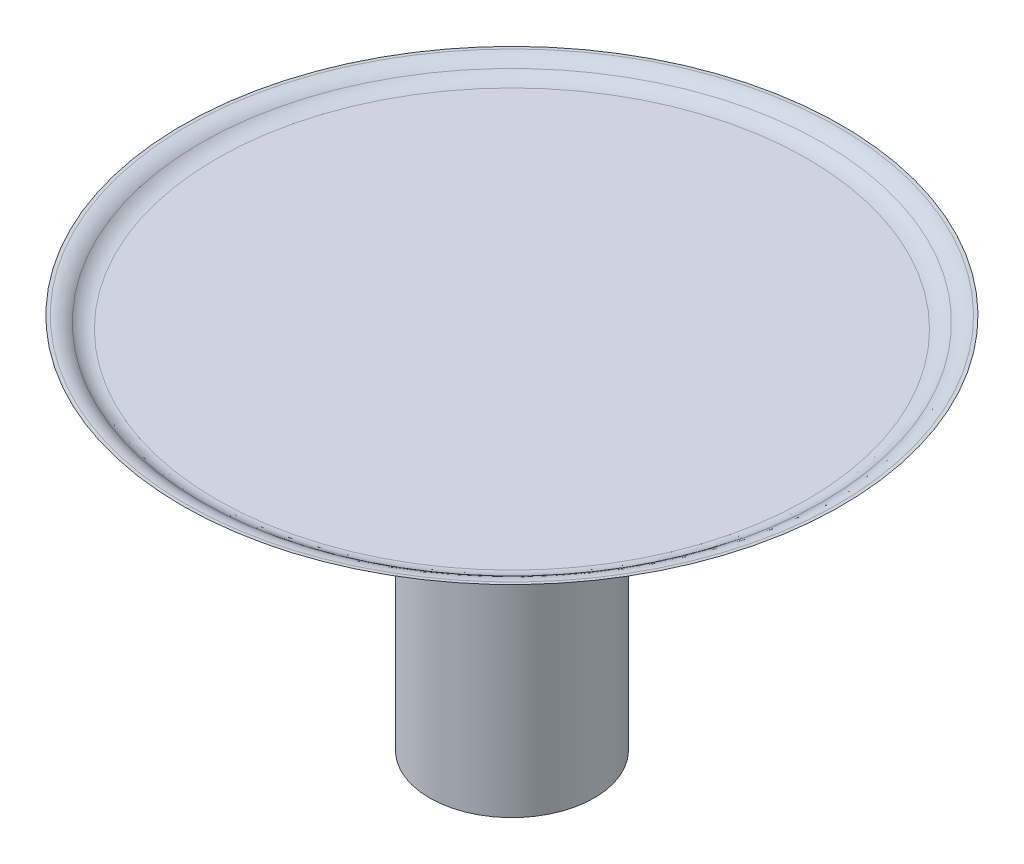
ISO-10303-21;
HEADER;
FILE_DESCRIPTION(('STEP AP214'),'2;1');
FILE_NAME('part.step','',(''),(''),'','','');
FILE_SCHEMA(('AUTOMOTIVE_DESIGN { 1 0 10303 214 1 1 1 1 }'));
ENDSEC;
DATA;
#1=APPLICATION_CONTEXT('core data for automotive mechanical design processes');
#2=APPLICATION_PROTOCOL_DEFINITION('international standard','automotive_design',2000,#1);
#3=PRODUCT_CONTEXT('',#1,'mechanical');
#4=PRODUCT('Part','Part','',(#3));
#5=PRODUCT_RELATED_PRODUCT_CATEGORY('part','',(#4));
#6=PRODUCT_DEFINITION_FORMATION('','',#4);
#7=PRODUCT_DEFINITION_CONTEXT('part definition',#1,'design');
#8=PRODUCT_DEFINITION('design','',#6,#7);
#9=PRODUCT_DEFINITION_SHAPE('','',#8);
#10=(LENGTH_UNIT() NAMED_UNIT(*) SI_UNIT(.MILLI.,.METRE.));
#11=(NAMED_UNIT(*) PLANE_ANGLE_UNIT() SI_UNIT($,.RADIAN.));
#12=(NAMED_UNIT(*) SI_UNIT($,.STERADIAN.) SOLID_ANGLE_UNIT());
#13=UNCERTAINTY_MEASURE_WITH_UNIT(LENGTH_MEASURE(1.E-05),#10,'distance_accuracy_value','');
#14=(GEOMETRIC_REPRESENTATION_CONTEXT(3) GLOBAL_UNCERTAINTY_ASSIGNED_CONTEXT((#13)) GLOBAL_UNIT_ASSIGNED_CONTEXT((#10,
#11,#12)) REPRESENTATION_CONTEXT('',''));
#15=CARTESIAN_POINT('',(0.,0.,0.));
#16=DIRECTION('',(0.,0.,1.));
#17=DIRECTION('',(1.,0.,0.));
#18=AXIS2_PLACEMENT_3D('',#15,#16,#17);
#19=CARTESIAN_POINT('',(0.,10.,0.));
#20=DIRECTION('',(0.,-1.,0.));
#21=DIRECTION('',(0.,0.,-1.));
#22=AXIS2_PLACEMENT_3D('',#19,#20,#21);
#23=CYLINDRICAL_SURFACE('',#22,3.5);
#24=CARTESIAN_POINT('',(0.,10.,0.));
#25=DIRECTION('',(0.,1.,0.));
#26=DIRECTION('',(0.,0.,1.));
#27=AXIS2_PLACEMENT_3D('',#24,#25,#26);
#28=CIRCLE('',#27,3.5);
#29=CARTESIAN_POINT('',(0.,10.,3.5));
#30=VERTEX_POINT('',#29);
#31=EDGE_CURVE('E78',#30,#30,#28,.T.);
#32=ORIENTED_EDGE('',*,*,#31,.F.);
#33=EDGE_LOOP('',(#32));
#34=FACE_BOUND('',#33,.T.);
#35=CARTESIAN_POINT('',(0.,0.,0.));
#36=DIRECTION('',(0.,1.,0.));
#37=DIRECTION('',(0.,0.,1.));
#38=AXIS2_PLACEMENT_3D('',#35,#36,#37);
#39=CIRCLE('',#38,3.5);
#40=CARTESIAN_POINT('',(0.,0.,3.5));
#41=VERTEX_POINT('',#40);
#42=EDGE_CURVE('E74',#41,#41,#39,.T.);
#43=ORIENTED_EDGE('',*,*,#42,.T.);
#44=EDGE_LOOP('',(#43));
#45=FACE_BOUND('',#44,.T.);
#46=ADVANCED_FACE('F49',(#34,#45),#23,.T.);
#47=CARTESIAN_POINT('',(0.,10.,0.));
#48=DIRECTION('',(0.,1.,0.));
#49=DIRECTION('',(0.,0.,1.));
#50=AXIS2_PLACEMENT_3D('',#47,#48,#49);
#51=PLANE('',#50);
#52=CARTESIAN_POINT('',(0.,10.,0.));
#53=DIRECTION('',(0.,1.,0.));
#54=DIRECTION('',(0.,0.,1.));
#55=AXIS2_PLACEMENT_3D('',#52,#53,#54);
#56=CIRCLE('',#55,2.5);
#57=CARTESIAN_POINT('',(0.,10.,2.5));
#58=VERTEX_POINT('',#57);
#59=EDGE_CURVE('E73',#58,#58,#56,.T.);
#60=ORIENTED_EDGE('',*,*,#59,.F.);
#61=EDGE_LOOP('',(#60));
#62=FACE_BOUND('',#61,.T.);
#63=ORIENTED_EDGE('',*,*,#31,.T.);
#64=EDGE_LOOP('',(#63));
#65=FACE_BOUND('',#64,.T.);
#66=ADVANCED_FACE('F121',(#62,#65),#51,.T.);
#67=CARTESIAN_POINT('',(0.,0.,0.));
#68=DIRECTION('',(0.,1.,0.));
#69=DIRECTION('',(0.,0.,1.));
#70=AXIS2_PLACEMENT_3D('',#67,#68,#69);
#71=PLANE('',#70);
#72=ORIENTED_EDGE('',*,*,#42,.F.);
#73=EDGE_LOOP('',(#72));
#74=FACE_BOUND('',#73,.T.);
#75=ADVANCED_FACE('F127',(#74),#71,.F.);
#76=CARTESIAN_POINT('',(0.,12.,0.));
#77=DIRECTION('',(0.,-1.,0.));
#78=DIRECTION('',(0.,0.,-1.));
#79=AXIS2_PLACEMENT_3D('',#76,#77,#78);
#80=CYLINDRICAL_SURFACE('',#79,2.5);
#81=CARTESIAN_POINT('',(0.,12.,0.));
#82=DIRECTION('',(0.,1.,0.));
#83=DIRECTION('',(0.,0.,1.));
#84=AXIS2_PLACEMENT_3D('',#81,#82,#83);
#85=CIRCLE('',#84,2.5);
#86=CARTESIAN_POINT('',(0.,12.,2.5));
#87=VERTEX_POINT('',#86);
#88=EDGE_CURVE('E79',#87,#87,#85,.T.);
#89=ORIENTED_EDGE('',*,*,#88,.F.);
#90=EDGE_LOOP('',(#89));
#91=FACE_BOUND('',#90,.T.);
#92=ORIENTED_EDGE('',*,*,#59,.T.);
#93=EDGE_LOOP('',(#92));
#94=FACE_BOUND('',#93,.T.);
#95=ADVANCED_FACE('F133',(#91,#94),#80,.T.);
#96=CARTESIAN_POINT('',(0.,14.,0.));
#97=DIRECTION('',(0.,-1.,0.));
#98=DIRECTION('',(0.,0.,-1.));
#99=AXIS2_PLACEMENT_3D('',#96,#97,#98);
#100=CYLINDRICAL_SURFACE('',#99,3.5);
#101=CARTESIAN_POINT('',(0.,14.,0.));
#102=DIRECTION('',(0.,1.,0.));
#103=DIRECTION('',(0.,0.,1.));
#104=AXIS2_PLACEMENT_3D('',#101,#102,#103);
#105=CIRCLE('',#104,3.5);
#106=CARTESIAN_POINT('',(0.,14.,3.5));
#107=VERTEX_POINT('',#106);
#108=EDGE_CURVE('E89',#107,#107,#105,.T.);
#109=ORIENTED_EDGE('',*,*,#108,.F.);
#110=EDGE_LOOP('',(#109));
#111=FACE_BOUND('',#110,.T.);
#112=CARTESIAN_POINT('',(0.,12.,0.));
#113=DIRECTION('',(0.,1.,0.));
#114=DIRECTION('',(0.,0.,1.));
#115=AXIS2_PLACEMENT_3D('',#112,#113,#114);
#116=CIRCLE('',#115,3.5);
#117=CARTESIAN_POINT('',(0.,12.,3.5));
#118=VERTEX_POINT('',#117);
#119=EDGE_CURVE('E90',#118,#118,#116,.T.);
#120=ORIENTED_EDGE('',*,*,#119,.T.);
#121=EDGE_LOOP('',(#120));
#122=FACE_BOUND('',#121,.T.);
#123=ADVANCED_FACE('F138',(#111,#122),#100,.T.);
#124=CARTESIAN_POINT('',(0.,12.,0.));
#125=DIRECTION('',(0.,1.,0.));
#126=DIRECTION('',(0.,0.,1.));
#127=AXIS2_PLACEMENT_3D('',#124,#125,#126);
#128=PLANE('',#127);
#129=ORIENTED_EDGE('',*,*,#88,.T.);
#130=EDGE_LOOP('',(#129));
#131=FACE_BOUND('',#130,.T.);
#132=ORIENTED_EDGE('',*,*,#119,.F.);
#133=EDGE_LOOP('',(#132));
#134=FACE_BOUND('',#133,.T.);
#135=ADVANCED_FACE('F142',(#131,#134),#128,.F.);
#136=CARTESIAN_POINT('',(0.,16.,0.));
#137=DIRECTION('',(0.,1.,0.));
#138=DIRECTION('',(0.,0.,1.));
#139=AXIS2_PLACEMENT_3D('',#136,#137,#138);
#140=PLANE('',#139);
#141=CARTESIAN_POINT('',(0.,16.,0.));
#142=DIRECTION('',(0.,1.,0.));
#143=DIRECTION('',(0.,0.,1.));
#144=AXIS2_PLACEMENT_3D('',#141,#142,#143);
#145=CIRCLE('',#144,13.8660254037844);
#146=CARTESIAN_POINT('',(0.,16.,13.8660254037844));
#147=VERTEX_POINT('',#146);
#148=EDGE_CURVE('E62',#147,#147,#145,.F.);
#149=ORIENTED_EDGE('',*,*,#148,.T.);
#150=EDGE_LOOP('',(#149));
#151=FACE_BOUND('',#150,.T.);
#152=CARTESIAN_POINT('',(0.,16.,0.));
#153=DIRECTION('',(0.,1.,0.));
#154=DIRECTION('',(0.,0.,1.));
#155=AXIS2_PLACEMENT_3D('',#152,#153,#154);
#156=CIRCLE('',#155,14.);
#157=CARTESIAN_POINT('',(0.,16.,14.));
#158=VERTEX_POINT('',#157);
#159=EDGE_CURVE('E94',#158,#158,#156,.T.);
#160=ORIENTED_EDGE('',*,*,#159,.T.);
#161=EDGE_LOOP('',(#160));
#162=FACE_BOUND('',#161,.T.);
#163=ADVANCED_FACE('F102',(#151,#162),#140,.T.);
#164=CARTESIAN_POINT('',(0.,14.,0.));
#165=DIRECTION('',(0.,1.,0.));
#166=DIRECTION('',(0.,0.,1.));
#167=AXIS2_PLACEMENT_3D('',#164,#165,#166);
#168=PLANE('',#167);
#169=CARTESIAN_POINT('',(0.,14.,0.));
#170=DIRECTION('',(0.,1.,0.));
#171=DIRECTION('',(0.,0.,1.));
#172=AXIS2_PLACEMENT_3D('',#169,#170,#171);
#173=CIRCLE('',#172,8.);
#174=CARTESIAN_POINT('',(0.,14.,8.));
#175=VERTEX_POINT('',#174);
#176=EDGE_CURVE('E67',#175,#175,#173,.F.);
#177=ORIENTED_EDGE('',*,*,#176,.T.);
#178=EDGE_LOOP('',(#177));
#179=FACE_BOUND('',#178,.T.);
#180=ORIENTED_EDGE('',*,*,#108,.T.);
#181=EDGE_LOOP('',(#180));
#182=FACE_BOUND('',#181,.T.);
#183=ADVANCED_FACE('F107',(#179,#182),#168,.F.);
#184=CARTESIAN_POINT('',(0.,24.,0.));
#185=DIRECTION('',(0.,-1.,0.));
#186=DIRECTION('',(0.,0.,-1.));
#187=AXIS2_PLACEMENT_3D('',#184,#185,#186);
#188=DEGENERATE_TOROIDAL_SURFACE('',#187,8.,10.,.T.);
#189=ORIENTED_EDGE('',*,*,#176,.F.);
#190=EDGE_LOOP('',(#189));
#191=FACE_BOUND('',#190,.T.);
#192=ORIENTED_EDGE('',*,*,#159,.F.);
#193=EDGE_LOOP('',(#192));
#194=FACE_BOUND('',#193,.T.);
#195=ADVANCED_FACE('F104',(#191,#194),#188,.T.);
#196=CARTESIAN_POINT('',(0.,15.5,0.));
#197=DIRECTION('',(0.,1.,0.));
#198=DIRECTION('',(0.,0.,1.));
#199=AXIS2_PLACEMENT_3D('',#196,#197,#198);
#200=PLANE('',#199);
#201=CARTESIAN_POINT('',(0.,15.5,0.));
#202=DIRECTION('',(0.,1.,0.));
#203=DIRECTION('',(0.,0.,1.));
#204=AXIS2_PLACEMENT_3D('',#201,#202,#203);
#205=CIRCLE('',#204,12.5431497482521);
#206=CARTESIAN_POINT('',(0.,15.5,12.5431497482521));
#207=VERTEX_POINT('',#206);
#208=EDGE_CURVE('E57',#207,#207,#205,.T.);
#209=ORIENTED_EDGE('',*,*,#208,.T.);
#210=EDGE_LOOP('',(#209));
#211=FACE_BOUND('',#210,.T.);
#212=ADVANCED_FACE('F106',(#211),#200,.T.);
#213=CARTESIAN_POINT('',(0.,15.,0.));
#214=DIRECTION('',(0.,1.,0.));
#215=DIRECTION('',(0.,0.,1.));
#216=AXIS2_PLACEMENT_3D('',#213,#214,#215);
#217=TOROIDAL_SURFACE('',#216,13.8660254037844,1.);
#218=CARTESIAN_POINT('',(0.,15.75,0.));
#219=DIRECTION('',(0.,-1.,0.));
#220=DIRECTION('',(0.,0.,-1.));
#221=AXIS2_PLACEMENT_3D('',#218,#219,#220);
#222=CIRCLE('',#221,13.2045875760183);
#223=CARTESIAN_POINT('',(0.,15.75,-13.2045875760183));
#224=VERTEX_POINT('',#223);
#225=EDGE_CURVE('E10',#224,#224,#222,.T.);
#226=ORIENTED_EDGE('',*,*,#225,.T.);
#227=EDGE_LOOP('',(#226));
#228=FACE_BOUND('',#227,.T.);
#229=ORIENTED_EDGE('',*,*,#148,.F.);
#230=EDGE_LOOP('',(#229));
#231=FACE_BOUND('',#230,.T.);
#232=ADVANCED_FACE('F114',(#228,#231),#217,.T.);
#233=CARTESIAN_POINT('',(0.,16.5,0.));
#234=DIRECTION('',(0.,-1.,0.));
#235=DIRECTION('',(0.,0.,-1.));
#236=AXIS2_PLACEMENT_3D('',#233,#234,#235);
#237=TOROIDAL_SURFACE('',#236,12.5431497482521,1.);
#238=ORIENTED_EDGE('',*,*,#225,.F.);
#239=EDGE_LOOP('',(#238));
#240=FACE_BOUND('',#239,.T.);
#241=ORIENTED_EDGE('',*,*,#208,.F.);
#242=EDGE_LOOP('',(#241));
#243=FACE_BOUND('',#242,.T.);
#244=ADVANCED_FACE('F51',(#240,#243),#237,.F.);
#245=CLOSED_SHELL('',(#46,#66,#75,#95,#123,#135,#163,#183,#195,#212,#232,#244));
#246=MANIFOLD_SOLID_BREP('B2',#245);
#247=ADVANCED_BREP_SHAPE_REPRESENTATION('',(#18,#246),#14);
#248=SHAPE_DEFINITION_REPRESENTATION(#9,#247);
ENDSEC;
END-ISO-10303-21;
